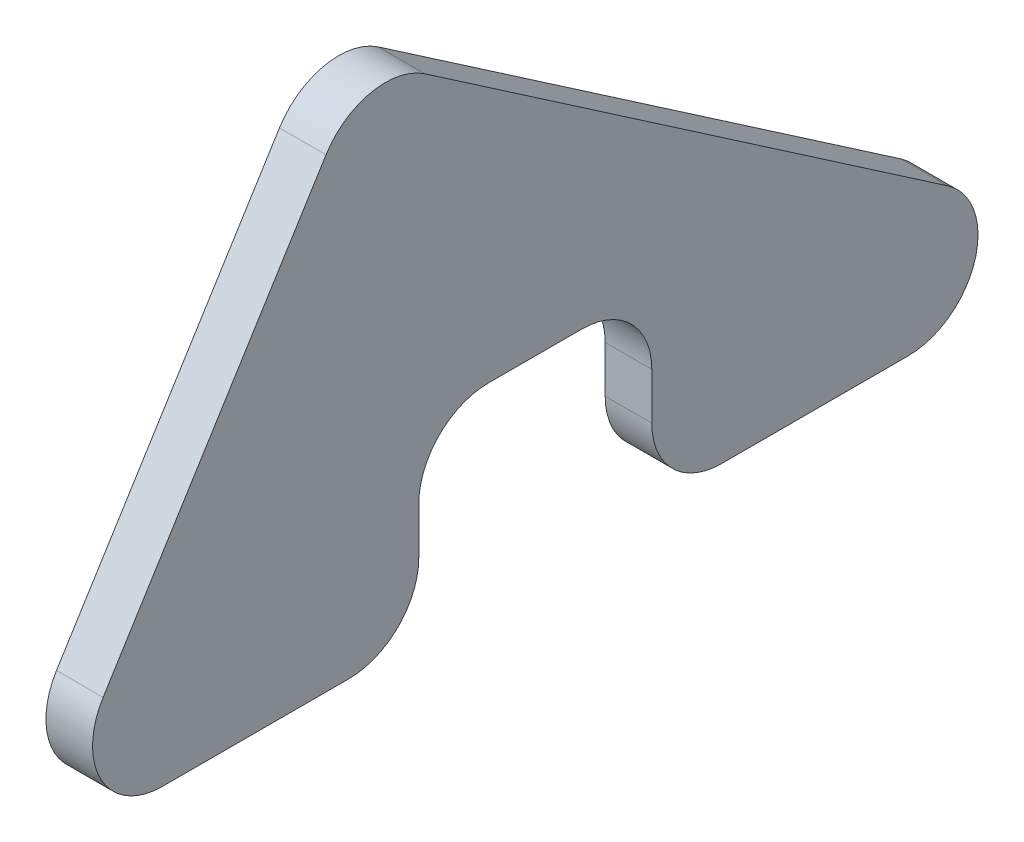
ISO-10303-21;
HEADER;
FILE_DESCRIPTION(('STEP AP214'),'2;1');
FILE_NAME('part.step','',(''),(''),'','','');
FILE_SCHEMA(('AUTOMOTIVE_DESIGN { 1 0 10303 214 1 1 1 1 }'));
ENDSEC;
DATA;
#1=APPLICATION_CONTEXT('core data for automotive mechanical design processes');
#2=APPLICATION_PROTOCOL_DEFINITION('international standard','automotive_design',2000,#1);
#3=PRODUCT_CONTEXT('',#1,'mechanical');
#4=PRODUCT('Part','Part','',(#3));
#5=PRODUCT_RELATED_PRODUCT_CATEGORY('part','',(#4));
#6=PRODUCT_DEFINITION_FORMATION('','',#4);
#7=PRODUCT_DEFINITION_CONTEXT('part definition',#1,'design');
#8=PRODUCT_DEFINITION('design','',#6,#7);
#9=PRODUCT_DEFINITION_SHAPE('','',#8);
#10=(LENGTH_UNIT() NAMED_UNIT(*) SI_UNIT(.MILLI.,.METRE.));
#11=(NAMED_UNIT(*) PLANE_ANGLE_UNIT() SI_UNIT($,.RADIAN.));
#12=(NAMED_UNIT(*) SI_UNIT($,.STERADIAN.) SOLID_ANGLE_UNIT());
#13=UNCERTAINTY_MEASURE_WITH_UNIT(LENGTH_MEASURE(1.E-05),#10,'distance_accuracy_value','');
#14=(GEOMETRIC_REPRESENTATION_CONTEXT(3) GLOBAL_UNCERTAINTY_ASSIGNED_CONTEXT((#13)) GLOBAL_UNIT_ASSIGNED_CONTEXT((#10,
#11,#12)) REPRESENTATION_CONTEXT('',''));
#15=CARTESIAN_POINT('',(0.,0.,0.));
#16=DIRECTION('',(0.,0.,1.));
#17=DIRECTION('',(1.,0.,0.));
#18=AXIS2_PLACEMENT_3D('',#15,#16,#17);
#19=CARTESIAN_POINT('',(95.250062484,193.736842549416,-1174.7461050612));
#20=DIRECTION('',(1.,0.,0.));
#21=DIRECTION('',(0.,0.,1.));
#22=AXIS2_PLACEMENT_3D('',#19,#20,#21);
#23=CYLINDRICAL_SURFACE('',#22,9.52500000000001);
#24=CARTESIAN_POINT('',(101.600062484,193.736842549416,-1174.7461050612));
#25=DIRECTION('',(-1.,0.,0.));
#26=DIRECTION('',(0.,0.,1.));
#27=AXIS2_PLACEMENT_3D('',#24,#25,#26);
#28=CIRCLE('',#27,9.52500000000001);
#29=CARTESIAN_POINT('',(101.600062484,198.767405068879,-1166.65789971404));
#30=VERTEX_POINT('',#29);
#31=CARTESIAN_POINT('',(101.600062484,201.592893616629,-1180.13202064069));
#32=VERTEX_POINT('',#31);
#33=EDGE_CURVE('E161',#30,#32,#28,.T.);
#34=ORIENTED_EDGE('',*,*,#33,.T.);
#35=DIRECTION('',(1.,0.,0.));
#36=VECTOR('',#35,1.);
#37=CARTESIAN_POINT('',(95.250062484,201.592893616629,-1180.13202064069));
#38=LINE('',#37,#36);
#39=CARTESIAN_POINT('',(95.250062484,201.592893616629,-1180.13202064069));
#40=VERTEX_POINT('',#39);
#41=EDGE_CURVE('E143',#40,#32,#38,.T.);
#42=ORIENTED_EDGE('',*,*,#41,.F.);
#43=CARTESIAN_POINT('',(95.250062484,193.736842549416,-1174.7461050612));
#44=DIRECTION('',(-1.,0.,0.));
#45=DIRECTION('',(0.,0.,1.));
#46=AXIS2_PLACEMENT_3D('',#43,#44,#45);
#47=CIRCLE('',#46,9.52500000000001);
#48=CARTESIAN_POINT('',(95.250062484,198.767405068879,-1166.65789971404));
#49=VERTEX_POINT('',#48);
#50=EDGE_CURVE('E149',#49,#40,#47,.T.);
#51=ORIENTED_EDGE('',*,*,#50,.F.);
#52=DIRECTION('',(1.,0.,0.));
#53=VECTOR('',#52,1.);
#54=CARTESIAN_POINT('',(95.250062484,198.767405068879,-1166.65789971404));
#55=LINE('',#54,#53);
#56=EDGE_CURVE('E173',#49,#30,#55,.T.);
#57=ORIENTED_EDGE('',*,*,#56,.T.);
#58=EDGE_LOOP('',(#34,#42,#51,#57));
#59=FACE_BOUND('',#58,.T.);
#60=ADVANCED_FACE('F41',(#59),#23,.T.);
#61=CARTESIAN_POINT('',(95.250062484,198.767405068879,-1166.65789971404));
#62=DIRECTION('',(0.,0.528143046662782,0.849155417024324));
#63=DIRECTION('',(0.,0.849155417024324,-0.528143046662782));
#64=AXIS2_PLACEMENT_3D('',#61,#62,#63);
#65=PLANE('',#64);
#66=DIRECTION('',(0.,0.849155417024324,-0.528143046662782));
#67=VECTOR('',#66,1.);
#68=CARTESIAN_POINT('',(101.600062484,198.767405068879,-1166.65789971404));
#69=LINE('',#68,#67);
#70=CARTESIAN_POINT('',(101.600062484,149.935137073463,-1136.28604754483));
#71=VERTEX_POINT('',#70);
#72=EDGE_CURVE('E158',#71,#30,#69,.T.);
#73=ORIENTED_EDGE('',*,*,#72,.T.);
#74=ORIENTED_EDGE('',*,*,#56,.F.);
#75=DIRECTION('',(0.,0.849155417024324,-0.528143046662782));
#76=VECTOR('',#75,1.);
#77=CARTESIAN_POINT('',(95.250062484,198.767405068879,-1166.65789971404));
#78=LINE('',#77,#76);
#79=CARTESIAN_POINT('',(95.250062484,149.935137073463,-1136.28604754483));
#80=VERTEX_POINT('',#79);
#81=EDGE_CURVE('E154',#80,#49,#78,.T.);
#82=ORIENTED_EDGE('',*,*,#81,.F.);
#83=DIRECTION('',(1.,0.,0.));
#84=VECTOR('',#83,1.);
#85=CARTESIAN_POINT('',(95.250062484,149.935137073463,-1136.28604754483));
#86=LINE('',#85,#84);
#87=EDGE_CURVE('E237',#80,#71,#86,.T.);
#88=ORIENTED_EDGE('',*,*,#87,.T.);
#89=EDGE_LOOP('',(#73,#74,#82,#88));
#90=FACE_BOUND('',#89,.T.);
#91=ADVANCED_FACE('F278',(#90),#65,.T.);
#92=CARTESIAN_POINT('',(95.250062484,144.904574554,-1144.37425289198));
#93=DIRECTION('',(1.,0.,0.));
#94=DIRECTION('',(0.,0.,1.));
#95=AXIS2_PLACEMENT_3D('',#92,#93,#94);
#96=CYLINDRICAL_SURFACE('',#95,9.52500000000003);
#97=CARTESIAN_POINT('',(101.600062484,144.904574554,-1144.37425289198));
#98=DIRECTION('',(-1.,0.,0.));
#99=DIRECTION('',(0.,0.,1.));
#100=AXIS2_PLACEMENT_3D('',#97,#98,#99);
#101=CIRCLE('',#100,9.52500000000003);
#102=CARTESIAN_POINT('',(101.600062484,135.379574554,-1144.37425289198));
#103=VERTEX_POINT('',#102);
#104=EDGE_CURVE('E233',#103,#71,#101,.T.);
#105=ORIENTED_EDGE('',*,*,#104,.T.);
#106=ORIENTED_EDGE('',*,*,#87,.F.);
#107=CARTESIAN_POINT('',(95.250062484,144.904574554,-1144.37425289198));
#108=DIRECTION('',(-1.,0.,0.));
#109=DIRECTION('',(0.,0.,1.));
#110=AXIS2_PLACEMENT_3D('',#107,#108,#109);
#111=CIRCLE('',#110,9.52500000000003);
#112=CARTESIAN_POINT('',(95.250062484,135.379574554,-1144.37425289198));
#113=VERTEX_POINT('',#112);
#114=EDGE_CURVE('E165',#113,#80,#111,.T.);
#115=ORIENTED_EDGE('',*,*,#114,.F.);
#116=DIRECTION('',(1.,0.,0.));
#117=VECTOR('',#116,1.);
#118=CARTESIAN_POINT('',(95.250062484,135.379574554,-1144.37425289198));
#119=LINE('',#118,#117);
#120=EDGE_CURVE('E240',#113,#103,#119,.T.);
#121=ORIENTED_EDGE('',*,*,#120,.T.);
#122=EDGE_LOOP('',(#105,#106,#115,#121));
#123=FACE_BOUND('',#122,.T.);
#124=ADVANCED_FACE('F283',(#123),#96,.T.);
#125=CARTESIAN_POINT('',(95.250062484,135.379574554,-1169.77425289198));
#126=DIRECTION('',(0.,-1.,0.));
#127=DIRECTION('',(0.,0.,1.));
#128=AXIS2_PLACEMENT_3D('',#125,#126,#127);
#129=PLANE('',#128);
#130=DIRECTION('',(0.,0.,1.));
#131=VECTOR('',#130,1.);
#132=CARTESIAN_POINT('',(101.600062484,135.379574554,-1169.77425289198));
#133=LINE('',#132,#131);
#134=CARTESIAN_POINT('',(101.600062484,135.379574554,-1169.77425289198));
#135=VERTEX_POINT('',#134);
#136=EDGE_CURVE('E231',#135,#103,#133,.T.);
#137=ORIENTED_EDGE('',*,*,#136,.T.);
#138=ORIENTED_EDGE('',*,*,#120,.F.);
#139=DIRECTION('',(0.,0.,1.));
#140=VECTOR('',#139,1.);
#141=CARTESIAN_POINT('',(95.250062484,135.379574554,-1169.77425289198));
#142=LINE('',#141,#140);
#143=CARTESIAN_POINT('',(95.250062484,135.379574554,-1169.77425289198));
#144=VERTEX_POINT('',#143);
#145=EDGE_CURVE('E211',#144,#113,#142,.T.);
#146=ORIENTED_EDGE('',*,*,#145,.F.);
#147=DIRECTION('',(1.,0.,0.));
#148=VECTOR('',#147,1.);
#149=CARTESIAN_POINT('',(95.250062484,135.379574554,-1169.77425289198));
#150=LINE('',#149,#148);
#151=EDGE_CURVE('E243',#144,#135,#150,.T.);
#152=ORIENTED_EDGE('',*,*,#151,.T.);
#153=EDGE_LOOP('',(#137,#138,#146,#152));
#154=FACE_BOUND('',#153,.T.);
#155=ADVANCED_FACE('F301',(#154),#129,.T.);
#156=CARTESIAN_POINT('',(95.250062484,144.904574554,-1169.77425289198));
#157=DIRECTION('',(1.,0.,0.));
#158=DIRECTION('',(0.,0.,1.));
#159=AXIS2_PLACEMENT_3D('',#156,#157,#158);
#160=CYLINDRICAL_SURFACE('',#159,9.52500000000001);
#161=CARTESIAN_POINT('',(101.600062484,144.904574554,-1169.77425289198));
#162=DIRECTION('',(-1.,0.,0.));
#163=DIRECTION('',(0.,0.,1.));
#164=AXIS2_PLACEMENT_3D('',#161,#162,#163);
#165=CIRCLE('',#164,9.52500000000001);
#166=CARTESIAN_POINT('',(101.600062484,144.904574554,-1179.29925289198));
#167=VERTEX_POINT('',#166);
#168=EDGE_CURVE('E229',#167,#135,#165,.T.);
#169=ORIENTED_EDGE('',*,*,#168,.T.);
#170=ORIENTED_EDGE('',*,*,#151,.F.);
#171=CARTESIAN_POINT('',(95.250062484,144.904574554,-1169.77425289198));
#172=DIRECTION('',(-1.,0.,0.));
#173=DIRECTION('',(0.,0.,1.));
#174=AXIS2_PLACEMENT_3D('',#171,#172,#173);
#175=CIRCLE('',#174,9.52500000000001);
#176=CARTESIAN_POINT('',(95.250062484,144.904574554,-1179.29925289198));
#177=VERTEX_POINT('',#176);
#178=EDGE_CURVE('E209',#177,#144,#175,.T.);
#179=ORIENTED_EDGE('',*,*,#178,.F.);
#180=DIRECTION('',(1.,0.,0.));
#181=VECTOR('',#180,1.);
#182=CARTESIAN_POINT('',(95.250062484,144.904574554,-1179.29925289198));
#183=LINE('',#182,#181);
#184=EDGE_CURVE('E246',#177,#167,#183,.T.);
#185=ORIENTED_EDGE('',*,*,#184,.T.);
#186=EDGE_LOOP('',(#169,#170,#179,#185));
#187=FACE_BOUND('',#186,.T.);
#188=ADVANCED_FACE('F305',(#187),#160,.T.);
#189=CARTESIAN_POINT('',(95.250062484,160.779574554,-1179.29925289198));
#190=DIRECTION('',(0.,0.,-1.));
#191=DIRECTION('',(0.,-1.,0.));
#192=AXIS2_PLACEMENT_3D('',#189,#190,#191);
#193=PLANE('',#192);
#194=DIRECTION('',(0.,-1.,0.));
#195=VECTOR('',#194,1.);
#196=CARTESIAN_POINT('',(101.600062484,160.779574554,-1179.29925289198));
#197=LINE('',#196,#195);
#198=CARTESIAN_POINT('',(101.600062484,151.254574554,-1179.29925289198));
#199=VERTEX_POINT('',#198);
#200=EDGE_CURVE('E227',#199,#167,#197,.T.);
#201=ORIENTED_EDGE('',*,*,#200,.T.);
#202=ORIENTED_EDGE('',*,*,#184,.F.);
#203=DIRECTION('',(0.,-1.,0.));
#204=VECTOR('',#203,1.);
#205=CARTESIAN_POINT('',(95.250062484,160.779574554,-1179.29925289198));
#206=LINE('',#205,#204);
#207=CARTESIAN_POINT('',(95.250062484,151.254574554,-1179.29925289198));
#208=VERTEX_POINT('',#207);
#209=EDGE_CURVE('E202',#208,#177,#206,.T.);
#210=ORIENTED_EDGE('',*,*,#209,.F.);
#211=DIRECTION('',(1.,0.,0.));
#212=VECTOR('',#211,1.);
#213=CARTESIAN_POINT('',(95.250062484,151.254574554,-1179.29925289198));
#214=LINE('',#213,#212);
#215=EDGE_CURVE('E178',#199,#208,#214,.F.);
#216=ORIENTED_EDGE('',*,*,#215,.F.);
#217=EDGE_LOOP('',(#201,#202,#210,#216));
#218=FACE_BOUND('',#217,.T.);
#219=ADVANCED_FACE('F309',(#218),#193,.T.);
#220=CARTESIAN_POINT('',(95.250062484,160.779574554,-1184.54859538718));
#221=DIRECTION('',(0.,-1.,0.));
#222=DIRECTION('',(0.,0.,1.));
#223=AXIS2_PLACEMENT_3D('',#220,#221,#222);
#224=PLANE('',#223);
#225=DIRECTION('',(0.,0.,1.));
#226=VECTOR('',#225,1.);
#227=CARTESIAN_POINT('',(101.600062484,160.779574554,-1184.54859538718));
#228=LINE('',#227,#226);
#229=CARTESIAN_POINT('',(101.600062484,160.779574554,-1201.52425289198));
#230=VERTEX_POINT('',#229);
#231=CARTESIAN_POINT('',(101.600062484,160.779574554,-1188.82425289198));
#232=VERTEX_POINT('',#231);
#233=EDGE_CURVE('E224',#230,#232,#228,.T.);
#234=ORIENTED_EDGE('',*,*,#233,.T.);
#235=DIRECTION('',(1.,0.,0.));
#236=VECTOR('',#235,1.);
#237=CARTESIAN_POINT('',(101.600062484,160.779574554,-1188.82425289198));
#238=LINE('',#237,#236);
#239=CARTESIAN_POINT('',(95.250062484,160.779574554,-1188.82425289198));
#240=VERTEX_POINT('',#239);
#241=EDGE_CURVE('E172',#240,#232,#238,.T.);
#242=ORIENTED_EDGE('',*,*,#241,.F.);
#243=DIRECTION('',(0.,0.,1.));
#244=VECTOR('',#243,1.);
#245=CARTESIAN_POINT('',(95.250062484,160.779574554,-1184.54859538718));
#246=LINE('',#245,#244);
#247=CARTESIAN_POINT('',(95.250062484,160.779574554,-1201.52425289198));
#248=VERTEX_POINT('',#247);
#249=EDGE_CURVE('E200',#248,#240,#246,.T.);
#250=ORIENTED_EDGE('',*,*,#249,.F.);
#251=DIRECTION('',(1.,0.,0.));
#252=VECTOR('',#251,1.);
#253=CARTESIAN_POINT('',(95.250062484,160.779574554,-1201.52425289198));
#254=LINE('',#253,#252);
#255=EDGE_CURVE('E175',#230,#248,#254,.F.);
#256=ORIENTED_EDGE('',*,*,#255,.F.);
#257=EDGE_LOOP('',(#234,#242,#250,#256));
#258=FACE_BOUND('',#257,.T.);
#259=ADVANCED_FACE('F275',(#258),#224,.T.);
#260=CARTESIAN_POINT('',(95.250062484,144.904574554,-1211.04925289198));
#261=DIRECTION('',(0.,0.,1.));
#262=DIRECTION('',(-1.,0.,0.));
#263=AXIS2_PLACEMENT_3D('',#260,#261,#262);
#264=PLANE('',#263);
#265=DIRECTION('',(0.,1.,0.));
#266=VECTOR('',#265,1.);
#267=CARTESIAN_POINT('',(95.250062484,144.904574554,-1211.04925289198));
#268=LINE('',#267,#266);
#269=CARTESIAN_POINT('',(95.250062484,144.904574554,-1211.04925289198));
#270=VERTEX_POINT('',#269);
#271=CARTESIAN_POINT('',(95.250062484,151.254574554,-1211.04925289198));
#272=VERTEX_POINT('',#271);
#273=EDGE_CURVE('E194',#270,#272,#268,.T.);
#274=ORIENTED_EDGE('',*,*,#273,.F.);
#275=DIRECTION('',(1.,0.,0.));
#276=VECTOR('',#275,1.);
#277=CARTESIAN_POINT('',(95.250062484,144.904574554,-1211.04925289198));
#278=LINE('',#277,#276);
#279=CARTESIAN_POINT('',(101.600062484,144.904574554,-1211.04925289198));
#280=VERTEX_POINT('',#279);
#281=EDGE_CURVE('E249',#270,#280,#278,.T.);
#282=ORIENTED_EDGE('',*,*,#281,.T.);
#283=DIRECTION('',(0.,1.,0.));
#284=VECTOR('',#283,1.);
#285=CARTESIAN_POINT('',(101.600062484,144.904574554,-1211.04925289198));
#286=LINE('',#285,#284);
#287=CARTESIAN_POINT('',(101.600062484,151.254574554,-1211.04925289198));
#288=VERTEX_POINT('',#287);
#289=EDGE_CURVE('E196',#280,#288,#286,.T.);
#290=ORIENTED_EDGE('',*,*,#289,.T.);
#291=DIRECTION('',(1.,0.,0.));
#292=VECTOR('',#291,1.);
#293=CARTESIAN_POINT('',(101.600062484,151.254574554,-1211.04925289198));
#294=LINE('',#293,#292);
#295=EDGE_CURVE('E169',#272,#288,#294,.T.);
#296=ORIENTED_EDGE('',*,*,#295,.F.);
#297=EDGE_LOOP('',(#274,#282,#290,#296));
#298=FACE_BOUND('',#297,.T.);
#299=ADVANCED_FACE('F192',(#298),#264,.T.);
#300=CARTESIAN_POINT('',(95.250062484,144.904574554,-1220.57425289198));
#301=DIRECTION('',(1.,0.,0.));
#302=DIRECTION('',(0.,0.,1.));
#303=AXIS2_PLACEMENT_3D('',#300,#301,#302);
#304=CYLINDRICAL_SURFACE('',#303,9.52500000000001);
#305=CARTESIAN_POINT('',(101.600062484,144.904574554,-1220.57425289198));
#306=DIRECTION('',(-1.,0.,0.));
#307=DIRECTION('',(0.,0.,1.));
#308=AXIS2_PLACEMENT_3D('',#305,#306,#307);
#309=CIRCLE('',#308,9.52500000000001);
#310=CARTESIAN_POINT('',(101.600062484,135.379574554,-1220.57425289198));
#311=VERTEX_POINT('',#310);
#312=EDGE_CURVE('E221',#311,#280,#309,.T.);
#313=ORIENTED_EDGE('',*,*,#312,.T.);
#314=ORIENTED_EDGE('',*,*,#281,.F.);
#315=CARTESIAN_POINT('',(95.250062484,144.904574554,-1220.57425289198));
#316=DIRECTION('',(-1.,0.,0.));
#317=DIRECTION('',(0.,0.,1.));
#318=AXIS2_PLACEMENT_3D('',#315,#316,#317);
#319=CIRCLE('',#318,9.52500000000001);
#320=CARTESIAN_POINT('',(95.250062484,135.379574554,-1220.57425289198));
#321=VERTEX_POINT('',#320);
#322=EDGE_CURVE('E198',#321,#270,#319,.T.);
#323=ORIENTED_EDGE('',*,*,#322,.F.);
#324=DIRECTION('',(1.,0.,0.));
#325=VECTOR('',#324,1.);
#326=CARTESIAN_POINT('',(95.250062484,135.379574554,-1220.57425289198));
#327=LINE('',#326,#325);
#328=EDGE_CURVE('E251',#321,#311,#327,.T.);
#329=ORIENTED_EDGE('',*,*,#328,.T.);
#330=EDGE_LOOP('',(#313,#314,#323,#329));
#331=FACE_BOUND('',#330,.T.);
#332=ADVANCED_FACE('F266',(#331),#304,.T.);
#333=CARTESIAN_POINT('',(95.250062484,135.379574554,-1245.97425289198));
#334=DIRECTION('',(0.,-1.,0.));
#335=DIRECTION('',(0.,0.,1.));
#336=AXIS2_PLACEMENT_3D('',#333,#334,#335);
#337=PLANE('',#336);
#338=DIRECTION('',(0.,0.,1.));
#339=VECTOR('',#338,1.);
#340=CARTESIAN_POINT('',(101.600062484,135.379574554,-1245.97425289198));
#341=LINE('',#340,#339);
#342=CARTESIAN_POINT('',(101.600062484,135.379574554,-1245.97425289198));
#343=VERTEX_POINT('',#342);
#344=EDGE_CURVE('E219',#343,#311,#341,.T.);
#345=ORIENTED_EDGE('',*,*,#344,.T.);
#346=ORIENTED_EDGE('',*,*,#328,.F.);
#347=DIRECTION('',(0.,0.,1.));
#348=VECTOR('',#347,1.);
#349=CARTESIAN_POINT('',(95.250062484,135.379574554,-1245.97425289198));
#350=LINE('',#349,#348);
#351=CARTESIAN_POINT('',(95.250062484,135.379574554,-1245.97425289198));
#352=VERTEX_POINT('',#351);
#353=EDGE_CURVE('E204',#352,#321,#350,.T.);
#354=ORIENTED_EDGE('',*,*,#353,.F.);
#355=DIRECTION('',(1.,0.,0.));
#356=VECTOR('',#355,1.);
#357=CARTESIAN_POINT('',(95.250062484,135.379574554,-1245.97425289198));
#358=LINE('',#357,#356);
#359=EDGE_CURVE('E163',#352,#343,#358,.T.);
#360=ORIENTED_EDGE('',*,*,#359,.T.);
#361=EDGE_LOOP('',(#345,#346,#354,#360));
#362=FACE_BOUND('',#361,.T.);
#363=ADVANCED_FACE('F258',(#362),#337,.T.);
#364=CARTESIAN_POINT('',(95.250062484,144.904574554,-1245.97425289198));
#365=DIRECTION('',(1.,0.,0.));
#366=DIRECTION('',(0.,0.,1.));
#367=AXIS2_PLACEMENT_3D('',#364,#365,#366);
#368=CYLINDRICAL_SURFACE('',#367,9.525);
#369=CARTESIAN_POINT('',(101.600062484,144.904574554,-1245.97425289198));
#370=DIRECTION('',(-1.,0.,0.));
#371=DIRECTION('',(0.,0.,1.));
#372=AXIS2_PLACEMENT_3D('',#369,#370,#371);
#373=CIRCLE('',#372,9.525);
#374=CARTESIAN_POINT('',(101.600062484,152.760625621212,-1251.36016847147));
#375=VERTEX_POINT('',#374);
#376=EDGE_CURVE('E217',#375,#343,#373,.T.);
#377=ORIENTED_EDGE('',*,*,#376,.T.);
#378=ORIENTED_EDGE('',*,*,#359,.F.);
#379=CARTESIAN_POINT('',(95.250062484,144.904574554,-1245.97425289198));
#380=DIRECTION('',(-1.,0.,0.));
#381=DIRECTION('',(0.,0.,1.));
#382=AXIS2_PLACEMENT_3D('',#379,#380,#381);
#383=CIRCLE('',#382,9.525);
#384=CARTESIAN_POINT('',(95.250062484,152.760625621212,-1251.36016847147));
#385=VERTEX_POINT('',#384);
#386=EDGE_CURVE('E148',#385,#352,#383,.T.);
#387=ORIENTED_EDGE('',*,*,#386,.F.);
#388=DIRECTION('',(1.,0.,0.));
#389=VECTOR('',#388,1.);
#390=CARTESIAN_POINT('',(95.250062484,152.760625621212,-1251.36016847147));
#391=LINE('',#390,#389);
#392=EDGE_CURVE('E146',#385,#375,#391,.T.);
#393=ORIENTED_EDGE('',*,*,#392,.T.);
#394=EDGE_LOOP('',(#377,#378,#387,#393));
#395=FACE_BOUND('',#394,.T.);
#396=ADVANCED_FACE('F273',(#395),#368,.T.);
#397=CARTESIAN_POINT('',(95.250062484,201.592893616629,-1180.13202064069));
#398=DIRECTION('',(0.,0.824782264274242,-0.56545045453926));
#399=DIRECTION('',(0.,-0.56545045453926,-0.824782264274242));
#400=AXIS2_PLACEMENT_3D('',#397,#398,#399);
#401=PLANE('',#400);
#402=DIRECTION('',(0.,-0.56545045453926,-0.824782264274241));
#403=VECTOR('',#402,1.);
#404=CARTESIAN_POINT('',(101.600062484,201.592893616629,-1180.13202064069));
#405=LINE('',#404,#403);
#406=EDGE_CURVE('E215',#32,#375,#405,.T.);
#407=ORIENTED_EDGE('',*,*,#406,.T.);
#408=ORIENTED_EDGE('',*,*,#392,.F.);
#409=DIRECTION('',(0.,-0.56545045453926,-0.824782264274241));
#410=VECTOR('',#409,1.);
#411=CARTESIAN_POINT('',(95.250062484,201.592893616629,-1180.13202064069));
#412=LINE('',#411,#410);
#413=EDGE_CURVE('E139',#40,#385,#412,.T.);
#414=ORIENTED_EDGE('',*,*,#413,.F.);
#415=ORIENTED_EDGE('',*,*,#41,.T.);
#416=EDGE_LOOP('',(#407,#408,#414,#415));
#417=FACE_BOUND('',#416,.T.);
#418=ADVANCED_FACE('F141',(#417),#401,.T.);
#419=CARTESIAN_POINT('',(95.250062484,193.736842549416,-1174.7461050612));
#420=DIRECTION('',(1.,0.,0.));
#421=DIRECTION('',(0.,0.,1.));
#422=AXIS2_PLACEMENT_3D('',#419,#420,#421);
#423=PLANE('',#422);
#424=ORIENTED_EDGE('',*,*,#50,.T.);
#425=ORIENTED_EDGE('',*,*,#413,.T.);
#426=ORIENTED_EDGE('',*,*,#386,.T.);
#427=ORIENTED_EDGE('',*,*,#353,.T.);
#428=ORIENTED_EDGE('',*,*,#322,.T.);
#429=ORIENTED_EDGE('',*,*,#273,.T.);
#430=CARTESIAN_POINT('',(95.250062484,151.254574554,-1201.52425289198));
#431=DIRECTION('',(-1.,0.,0.));
#432=DIRECTION('',(0.,0.,1.));
#433=AXIS2_PLACEMENT_3D('',#430,#431,#432);
#434=CIRCLE('',#433,9.525);
#435=EDGE_CURVE('E182',#248,#272,#434,.T.);
#436=ORIENTED_EDGE('',*,*,#435,.F.);
#437=ORIENTED_EDGE('',*,*,#249,.T.);
#438=CARTESIAN_POINT('',(95.250062484,151.254574554,-1188.82425289198));
#439=DIRECTION('',(-1.,0.,0.));
#440=DIRECTION('',(0.,0.,1.));
#441=AXIS2_PLACEMENT_3D('',#438,#439,#440);
#442=CIRCLE('',#441,9.525);
#443=EDGE_CURVE('E11',#208,#240,#442,.T.);
#444=ORIENTED_EDGE('',*,*,#443,.F.);
#445=ORIENTED_EDGE('',*,*,#209,.T.);
#446=ORIENTED_EDGE('',*,*,#178,.T.);
#447=ORIENTED_EDGE('',*,*,#145,.T.);
#448=ORIENTED_EDGE('',*,*,#114,.T.);
#449=ORIENTED_EDGE('',*,*,#81,.T.);
#450=EDGE_LOOP('',(#424,#425,#426,#427,#428,#429,#436,#437,#444,#445,#446,#447,#448,#449));
#451=FACE_BOUND('',#450,.T.);
#452=ADVANCED_FACE('F152',(#451),#423,.F.);
#453=CARTESIAN_POINT('',(101.600062484,193.736842549416,-1174.7461050612));
#454=DIRECTION('',(1.,0.,0.));
#455=DIRECTION('',(0.,0.,1.));
#456=AXIS2_PLACEMENT_3D('',#453,#454,#455);
#457=PLANE('',#456);
#458=ORIENTED_EDGE('',*,*,#33,.F.);
#459=ORIENTED_EDGE('',*,*,#72,.F.);
#460=ORIENTED_EDGE('',*,*,#104,.F.);
#461=ORIENTED_EDGE('',*,*,#136,.F.);
#462=ORIENTED_EDGE('',*,*,#168,.F.);
#463=ORIENTED_EDGE('',*,*,#200,.F.);
#464=CARTESIAN_POINT('',(101.600062484,151.254574554,-1188.82425289198));
#465=DIRECTION('',(-1.,0.,0.));
#466=DIRECTION('',(0.,0.,1.));
#467=AXIS2_PLACEMENT_3D('',#464,#465,#466);
#468=CIRCLE('',#467,9.525);
#469=EDGE_CURVE('E49',#232,#199,#468,.F.);
#470=ORIENTED_EDGE('',*,*,#469,.F.);
#471=ORIENTED_EDGE('',*,*,#233,.F.);
#472=CARTESIAN_POINT('',(101.600062484,151.254574554,-1201.52425289198));
#473=DIRECTION('',(-1.,0.,0.));
#474=DIRECTION('',(0.,0.,1.));
#475=AXIS2_PLACEMENT_3D('',#472,#473,#474);
#476=CIRCLE('',#475,9.525);
#477=EDGE_CURVE('E180',#288,#230,#476,.F.);
#478=ORIENTED_EDGE('',*,*,#477,.F.);
#479=ORIENTED_EDGE('',*,*,#289,.F.);
#480=ORIENTED_EDGE('',*,*,#312,.F.);
#481=ORIENTED_EDGE('',*,*,#344,.F.);
#482=ORIENTED_EDGE('',*,*,#376,.F.);
#483=ORIENTED_EDGE('',*,*,#406,.F.);
#484=EDGE_LOOP('',(#458,#459,#460,#461,#462,#463,#470,#471,#478,#479,#480,#481,#482,#483));
#485=FACE_BOUND('',#484,.T.);
#486=ADVANCED_FACE('F264',(#485),#457,.T.);
#487=CARTESIAN_POINT('',(95.250062484,151.254574554,-1201.52425289198));
#488=DIRECTION('',(-1.,0.,0.));
#489=DIRECTION('',(0.,0.,-1.));
#490=AXIS2_PLACEMENT_3D('',#487,#488,#489);
#491=CYLINDRICAL_SURFACE('',#490,9.525);
#492=ORIENTED_EDGE('',*,*,#435,.T.);
#493=ORIENTED_EDGE('',*,*,#295,.T.);
#494=ORIENTED_EDGE('',*,*,#477,.T.);
#495=ORIENTED_EDGE('',*,*,#255,.T.);
#496=EDGE_LOOP('',(#492,#493,#494,#495));
#497=FACE_BOUND('',#496,.T.);
#498=ADVANCED_FACE('F185',(#497),#491,.F.);
#499=CARTESIAN_POINT('',(95.250062484,151.254574554,-1188.82425289198));
#500=DIRECTION('',(-1.,0.,0.));
#501=DIRECTION('',(0.,0.,-1.));
#502=AXIS2_PLACEMENT_3D('',#499,#500,#501);
#503=CYLINDRICAL_SURFACE('',#502,9.525);
#504=ORIENTED_EDGE('',*,*,#443,.T.);
#505=ORIENTED_EDGE('',*,*,#241,.T.);
#506=ORIENTED_EDGE('',*,*,#469,.T.);
#507=ORIENTED_EDGE('',*,*,#215,.T.);
#508=EDGE_LOOP('',(#504,#505,#506,#507));
#509=FACE_BOUND('',#508,.T.);
#510=ADVANCED_FACE('F43',(#509),#503,.F.);
#511=CLOSED_SHELL('',(#60,#91,#124,#155,#188,#219,#259,#299,#332,#363,#396,#418,#452,#486,#498,#510));
#512=MANIFOLD_SOLID_BREP('B2',#511);
#513=ADVANCED_BREP_SHAPE_REPRESENTATION('',(#18,#512),#14);
#514=SHAPE_DEFINITION_REPRESENTATION(#9,#513);
ENDSEC;
END-ISO-10303-21;
